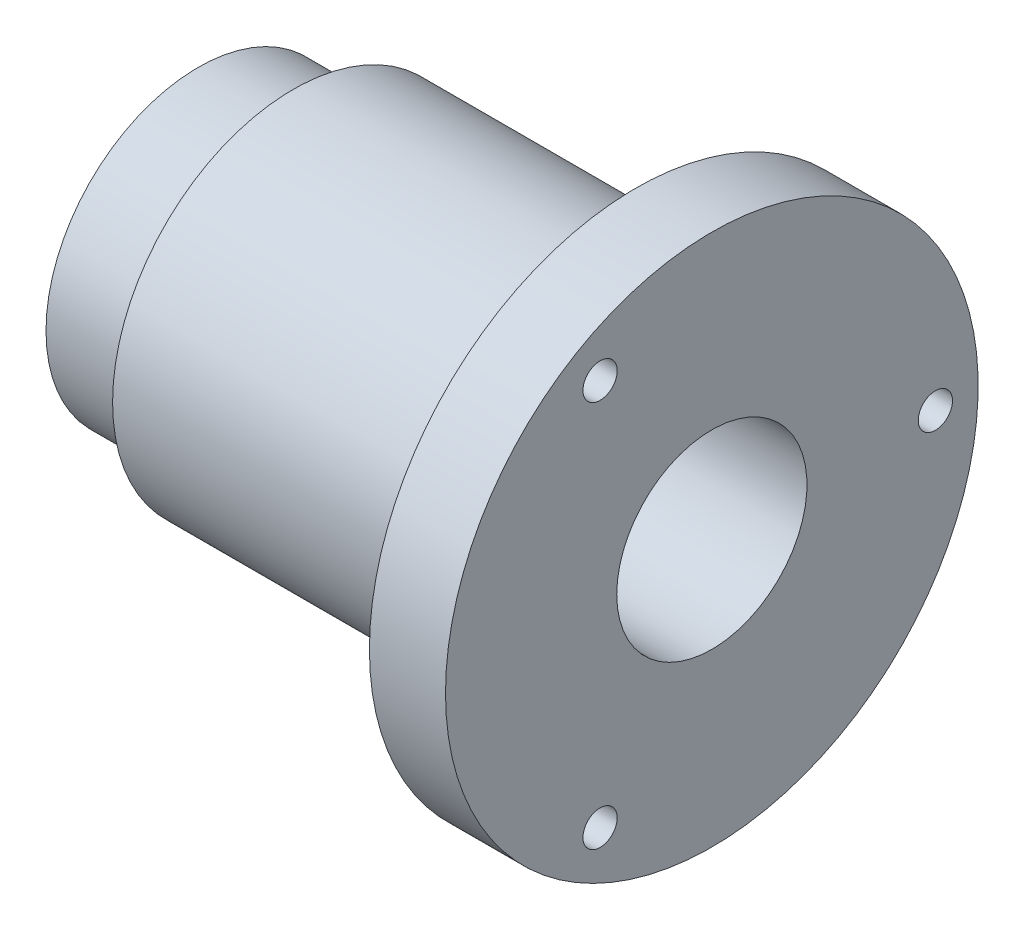
ISO-10303-21;
HEADER;
FILE_DESCRIPTION(('STEP AP214'),'2;1');
FILE_NAME('part.step','',(''),(''),'','','');
FILE_SCHEMA(('AUTOMOTIVE_DESIGN { 1 0 10303 214 1 1 1 1 }'));
ENDSEC;
DATA;
#1=APPLICATION_CONTEXT('core data for automotive mechanical design processes');
#2=APPLICATION_PROTOCOL_DEFINITION('international standard','automotive_design',2000,#1);
#3=PRODUCT_CONTEXT('',#1,'mechanical');
#4=PRODUCT('Part','Part','',(#3));
#5=PRODUCT_RELATED_PRODUCT_CATEGORY('part','',(#4));
#6=PRODUCT_DEFINITION_FORMATION('','',#4);
#7=PRODUCT_DEFINITION_CONTEXT('part definition',#1,'design');
#8=PRODUCT_DEFINITION('design','',#6,#7);
#9=PRODUCT_DEFINITION_SHAPE('','',#8);
#10=(LENGTH_UNIT() NAMED_UNIT(*) SI_UNIT(.MILLI.,.METRE.));
#11=(NAMED_UNIT(*) PLANE_ANGLE_UNIT() SI_UNIT($,.RADIAN.));
#12=(NAMED_UNIT(*) SI_UNIT($,.STERADIAN.) SOLID_ANGLE_UNIT());
#13=UNCERTAINTY_MEASURE_WITH_UNIT(LENGTH_MEASURE(1.E-05),#10,'distance_accuracy_value','');
#14=(GEOMETRIC_REPRESENTATION_CONTEXT(3) GLOBAL_UNCERTAINTY_ASSIGNED_CONTEXT((#13)) GLOBAL_UNIT_ASSIGNED_CONTEXT((#10,
#11,#12)) REPRESENTATION_CONTEXT('',''));
#15=CARTESIAN_POINT('',(0.,0.,0.));
#16=DIRECTION('',(0.,0.,1.));
#17=DIRECTION('',(1.,0.,0.));
#18=AXIS2_PLACEMENT_3D('',#15,#16,#17);
#19=CARTESIAN_POINT('',(0.,0.,-5.));
#20=DIRECTION('',(1.,0.,0.));
#21=DIRECTION('',(0.,0.,-1.));
#22=AXIS2_PLACEMENT_3D('',#19,#20,#21);
#23=PLANE('',#22);
#24=CARTESIAN_POINT('',(0.,0.,0.));
#25=DIRECTION('',(-1.,0.,0.));
#26=DIRECTION('',(0.,0.,1.));
#27=AXIS2_PLACEMENT_3D('',#24,#25,#26);
#28=CIRCLE('',#27,5.);
#29=CARTESIAN_POINT('',(0.,0.,5.));
#30=VERTEX_POINT('',#29);
#31=EDGE_CURVE('E61',#30,#30,#28,.T.);
#32=ORIENTED_EDGE('',*,*,#31,.F.);
#33=EDGE_LOOP('',(#32));
#34=FACE_BOUND('',#33,.T.);
#35=CARTESIAN_POINT('',(0.,0.,0.));
#36=DIRECTION('',(-1.,0.,0.));
#37=DIRECTION('',(0.,0.,1.));
#38=AXIS2_PLACEMENT_3D('',#35,#36,#37);
#39=CIRCLE('',#38,8.);
#40=CARTESIAN_POINT('',(0.,0.,8.));
#41=VERTEX_POINT('',#40);
#42=EDGE_CURVE('E10',#41,#41,#39,.T.);
#43=ORIENTED_EDGE('',*,*,#42,.T.);
#44=EDGE_LOOP('',(#43));
#45=FACE_BOUND('',#44,.T.);
#46=ADVANCED_FACE('F33',(#34,#45),#23,.F.);
#47=CARTESIAN_POINT('',(0.,0.,0.));
#48=DIRECTION('',(-1.,0.,0.));
#49=DIRECTION('',(0.,0.,1.));
#50=AXIS2_PLACEMENT_3D('',#47,#48,#49);
#51=CYLINDRICAL_SURFACE('',#50,8.);
#52=ORIENTED_EDGE('',*,*,#42,.F.);
#53=EDGE_LOOP('',(#52));
#54=FACE_BOUND('',#53,.T.);
#55=CARTESIAN_POINT('',(5.,0.,0.));
#56=DIRECTION('',(-1.,0.,0.));
#57=DIRECTION('',(0.,0.,1.));
#58=AXIS2_PLACEMENT_3D('',#55,#56,#57);
#59=CIRCLE('',#58,8.);
#60=CARTESIAN_POINT('',(5.,0.,8.));
#61=VERTEX_POINT('',#60);
#62=EDGE_CURVE('E39',#61,#61,#59,.T.);
#63=ORIENTED_EDGE('',*,*,#62,.T.);
#64=EDGE_LOOP('',(#63));
#65=FACE_BOUND('',#64,.T.);
#66=ADVANCED_FACE('F125',(#54,#65),#51,.T.);
#67=CARTESIAN_POINT('',(5.,0.,-8.));
#68=DIRECTION('',(1.,0.,0.));
#69=DIRECTION('',(0.,0.,-1.));
#70=AXIS2_PLACEMENT_3D('',#67,#68,#69);
#71=PLANE('',#70);
#72=ORIENTED_EDGE('',*,*,#62,.F.);
#73=EDGE_LOOP('',(#72));
#74=FACE_BOUND('',#73,.T.);
#75=CARTESIAN_POINT('',(5.,0.,0.));
#76=DIRECTION('',(-1.,0.,0.));
#77=DIRECTION('',(0.,0.,1.));
#78=AXIS2_PLACEMENT_3D('',#75,#76,#77);
#79=CIRCLE('',#78,9.5);
#80=CARTESIAN_POINT('',(5.,0.,9.5));
#81=VERTEX_POINT('',#80);
#82=EDGE_CURVE('E43',#81,#81,#79,.T.);
#83=ORIENTED_EDGE('',*,*,#82,.T.);
#84=EDGE_LOOP('',(#83));
#85=FACE_BOUND('',#84,.T.);
#86=ADVANCED_FACE('F129',(#74,#85),#71,.F.);
#87=CARTESIAN_POINT('',(0.,0.,0.));
#88=DIRECTION('',(-1.,0.,0.));
#89=DIRECTION('',(0.,0.,1.));
#90=AXIS2_PLACEMENT_3D('',#87,#88,#89);
#91=CYLINDRICAL_SURFACE('',#90,9.5);
#92=ORIENTED_EDGE('',*,*,#82,.F.);
#93=EDGE_LOOP('',(#92));
#94=FACE_BOUND('',#93,.T.);
#95=CARTESIAN_POINT('',(23.,0.,0.));
#96=DIRECTION('',(-1.,0.,0.));
#97=DIRECTION('',(0.,0.,1.));
#98=AXIS2_PLACEMENT_3D('',#95,#96,#97);
#99=CIRCLE('',#98,9.5);
#100=CARTESIAN_POINT('',(23.,0.,9.5));
#101=VERTEX_POINT('',#100);
#102=EDGE_CURVE('E47',#101,#101,#99,.T.);
#103=ORIENTED_EDGE('',*,*,#102,.T.);
#104=EDGE_LOOP('',(#103));
#105=FACE_BOUND('',#104,.T.);
#106=ADVANCED_FACE('F97',(#94,#105),#91,.T.);
#107=CARTESIAN_POINT('',(23.,0.,-9.5));
#108=DIRECTION('',(1.,0.,0.));
#109=DIRECTION('',(0.,0.,-1.));
#110=AXIS2_PLACEMENT_3D('',#107,#108,#109);
#111=PLANE('',#110);
#112=CARTESIAN_POINT('',(23.,-10.1757984944671,5.87500000000005));
#113=DIRECTION('',(-1.,0.,0.));
#114=DIRECTION('',(0.,0.866025403784436,-0.500000000000004));
#115=AXIS2_PLACEMENT_3D('',#112,#113,#114);
#116=CIRCLE('',#115,0.9);
#117=CARTESIAN_POINT('',(23.,-9.39637563106114,5.42500000000004));
#118=VERTEX_POINT('',#117);
#119=EDGE_CURVE('E68',#118,#118,#116,.T.);
#120=ORIENTED_EDGE('',*,*,#119,.F.);
#121=EDGE_LOOP('',(#120));
#122=FACE_BOUND('',#121,.T.);
#123=CARTESIAN_POINT('',(23.,10.1757984944672,5.87499999999991));
#124=DIRECTION('',(-1.,0.,0.));
#125=DIRECTION('',(0.,-0.866025403784443,-0.499999999999992));
#126=AXIS2_PLACEMENT_3D('',#123,#124,#125);
#127=CIRCLE('',#126,0.9);
#128=CARTESIAN_POINT('',(23.,9.39637563106121,5.42499999999991));
#129=VERTEX_POINT('',#128);
#130=EDGE_CURVE('E71',#129,#129,#127,.T.);
#131=ORIENTED_EDGE('',*,*,#130,.F.);
#132=EDGE_LOOP('',(#131));
#133=FACE_BOUND('',#132,.T.);
#134=CARTESIAN_POINT('',(23.,0.,-11.75));
#135=DIRECTION('',(-1.,0.,0.));
#136=DIRECTION('',(0.,0.,1.));
#137=AXIS2_PLACEMENT_3D('',#134,#135,#136);
#138=CIRCLE('',#137,0.9);
#139=CARTESIAN_POINT('',(23.,0.,-10.85));
#140=VERTEX_POINT('',#139);
#141=EDGE_CURVE('E65',#140,#140,#138,.T.);
#142=ORIENTED_EDGE('',*,*,#141,.F.);
#143=EDGE_LOOP('',(#142));
#144=FACE_BOUND('',#143,.T.);
#145=ORIENTED_EDGE('',*,*,#102,.F.);
#146=EDGE_LOOP('',(#145));
#147=FACE_BOUND('',#146,.T.);
#148=CARTESIAN_POINT('',(23.,0.,0.));
#149=DIRECTION('',(-1.,0.,0.));
#150=DIRECTION('',(0.,0.,1.));
#151=AXIS2_PLACEMENT_3D('',#148,#149,#150);
#152=CIRCLE('',#151,14.);
#153=CARTESIAN_POINT('',(23.,0.,14.));
#154=VERTEX_POINT('',#153);
#155=EDGE_CURVE('E52',#154,#154,#152,.T.);
#156=ORIENTED_EDGE('',*,*,#155,.T.);
#157=EDGE_LOOP('',(#156));
#158=FACE_BOUND('',#157,.T.);
#159=ADVANCED_FACE('F93',(#122,#133,#144,#147,#158),#111,.F.);
#160=CARTESIAN_POINT('',(0.,0.,0.));
#161=DIRECTION('',(-1.,0.,0.));
#162=DIRECTION('',(0.,0.,1.));
#163=AXIS2_PLACEMENT_3D('',#160,#161,#162);
#164=CYLINDRICAL_SURFACE('',#163,14.);
#165=ORIENTED_EDGE('',*,*,#155,.F.);
#166=EDGE_LOOP('',(#165));
#167=FACE_BOUND('',#166,.T.);
#168=CARTESIAN_POINT('',(27.,0.,0.));
#169=DIRECTION('',(-1.,0.,0.));
#170=DIRECTION('',(0.,0.,1.));
#171=AXIS2_PLACEMENT_3D('',#168,#169,#170);
#172=CIRCLE('',#171,14.);
#173=CARTESIAN_POINT('',(27.,0.,14.));
#174=VERTEX_POINT('',#173);
#175=EDGE_CURVE('E55',#174,#174,#172,.T.);
#176=ORIENTED_EDGE('',*,*,#175,.T.);
#177=EDGE_LOOP('',(#176));
#178=FACE_BOUND('',#177,.T.);
#179=ADVANCED_FACE('F96',(#167,#178),#164,.T.);
#180=CARTESIAN_POINT('',(27.,0.,-14.));
#181=DIRECTION('',(-1.,0.,0.));
#182=DIRECTION('',(0.,0.,1.));
#183=AXIS2_PLACEMENT_3D('',#180,#181,#182);
#184=PLANE('',#183);
#185=CARTESIAN_POINT('',(27.,-10.1757984944671,5.87500000000005));
#186=DIRECTION('',(-1.,0.,0.));
#187=DIRECTION('',(0.,0.866025403784436,-0.500000000000004));
#188=AXIS2_PLACEMENT_3D('',#185,#186,#187);
#189=CIRCLE('',#188,0.9);
#190=CARTESIAN_POINT('',(27.,-9.39637563106114,5.42500000000004));
#191=VERTEX_POINT('',#190);
#192=EDGE_CURVE('E74',#191,#191,#189,.T.);
#193=ORIENTED_EDGE('',*,*,#192,.T.);
#194=EDGE_LOOP('',(#193));
#195=FACE_BOUND('',#194,.T.);
#196=CARTESIAN_POINT('',(27.,10.1757984944672,5.87499999999991));
#197=DIRECTION('',(-1.,0.,0.));
#198=DIRECTION('',(0.,-0.866025403784443,-0.499999999999992));
#199=AXIS2_PLACEMENT_3D('',#196,#197,#198);
#200=CIRCLE('',#199,0.9);
#201=CARTESIAN_POINT('',(27.,9.39637563106121,5.42499999999991));
#202=VERTEX_POINT('',#201);
#203=EDGE_CURVE('E75',#202,#202,#200,.T.);
#204=ORIENTED_EDGE('',*,*,#203,.T.);
#205=EDGE_LOOP('',(#204));
#206=FACE_BOUND('',#205,.T.);
#207=CARTESIAN_POINT('',(27.,0.,-11.75));
#208=DIRECTION('',(-1.,0.,0.));
#209=DIRECTION('',(0.,0.,1.));
#210=AXIS2_PLACEMENT_3D('',#207,#208,#209);
#211=CIRCLE('',#210,0.9);
#212=CARTESIAN_POINT('',(27.,0.,-10.85));
#213=VERTEX_POINT('',#212);
#214=EDGE_CURVE('E64',#213,#213,#211,.T.);
#215=ORIENTED_EDGE('',*,*,#214,.T.);
#216=EDGE_LOOP('',(#215));
#217=FACE_BOUND('',#216,.T.);
#218=ORIENTED_EDGE('',*,*,#175,.F.);
#219=EDGE_LOOP('',(#218));
#220=FACE_BOUND('',#219,.T.);
#221=CARTESIAN_POINT('',(27.,0.,0.));
#222=DIRECTION('',(-1.,0.,0.));
#223=DIRECTION('',(0.,0.,1.));
#224=AXIS2_PLACEMENT_3D('',#221,#222,#223);
#225=CIRCLE('',#224,5.);
#226=CARTESIAN_POINT('',(27.,0.,5.));
#227=VERTEX_POINT('',#226);
#228=EDGE_CURVE('E58',#227,#227,#225,.T.);
#229=ORIENTED_EDGE('',*,*,#228,.T.);
#230=EDGE_LOOP('',(#229));
#231=FACE_BOUND('',#230,.T.);
#232=ADVANCED_FACE('F83',(#195,#206,#217,#220,#231),#184,.F.);
#233=CARTESIAN_POINT('',(0.,0.,0.));
#234=DIRECTION('',(-1.,0.,0.));
#235=DIRECTION('',(0.,0.,1.));
#236=AXIS2_PLACEMENT_3D('',#233,#234,#235);
#237=CYLINDRICAL_SURFACE('',#236,5.);
#238=ORIENTED_EDGE('',*,*,#228,.F.);
#239=EDGE_LOOP('',(#238));
#240=FACE_BOUND('',#239,.T.);
#241=ORIENTED_EDGE('',*,*,#31,.T.);
#242=EDGE_LOOP('',(#241));
#243=FACE_BOUND('',#242,.T.);
#244=ADVANCED_FACE('F114',(#240,#243),#237,.F.);
#245=CARTESIAN_POINT('',(27.,0.,-11.75));
#246=DIRECTION('',(-1.,0.,0.));
#247=DIRECTION('',(0.,0.,1.));
#248=AXIS2_PLACEMENT_3D('',#245,#246,#247);
#249=CYLINDRICAL_SURFACE('',#248,0.9);
#250=ORIENTED_EDGE('',*,*,#214,.F.);
#251=EDGE_LOOP('',(#250));
#252=FACE_BOUND('',#251,.T.);
#253=ORIENTED_EDGE('',*,*,#141,.T.);
#254=EDGE_LOOP('',(#253));
#255=FACE_BOUND('',#254,.T.);
#256=ADVANCED_FACE('F120',(#252,#255),#249,.F.);
#257=CARTESIAN_POINT('',(27.,10.1757984944672,5.87499999999991));
#258=DIRECTION('',(-1.,0.,0.));
#259=DIRECTION('',(0.,-0.866025403784443,-0.499999999999992));
#260=AXIS2_PLACEMENT_3D('',#257,#258,#259);
#261=CYLINDRICAL_SURFACE('',#260,0.9);
#262=ORIENTED_EDGE('',*,*,#203,.F.);
#263=EDGE_LOOP('',(#262));
#264=FACE_BOUND('',#263,.T.);
#265=ORIENTED_EDGE('',*,*,#130,.T.);
#266=EDGE_LOOP('',(#265));
#267=FACE_BOUND('',#266,.T.);
#268=ADVANCED_FACE('F89',(#264,#267),#261,.F.);
#269=CARTESIAN_POINT('',(27.,-10.1757984944671,5.87500000000005));
#270=DIRECTION('',(-1.,0.,0.));
#271=DIRECTION('',(0.,0.866025403784436,-0.500000000000004));
#272=AXIS2_PLACEMENT_3D('',#269,#270,#271);
#273=CYLINDRICAL_SURFACE('',#272,0.9);
#274=ORIENTED_EDGE('',*,*,#192,.F.);
#275=EDGE_LOOP('',(#274));
#276=FACE_BOUND('',#275,.T.);
#277=ORIENTED_EDGE('',*,*,#119,.T.);
#278=EDGE_LOOP('',(#277));
#279=FACE_BOUND('',#278,.T.);
#280=ADVANCED_FACE('F86',(#276,#279),#273,.F.);
#281=CLOSED_SHELL('',(#46,#66,#86,#106,#159,#179,#232,#244,#256,#268,#280));
#282=MANIFOLD_SOLID_BREP('B2',#281);
#283=ADVANCED_BREP_SHAPE_REPRESENTATION('',(#18,#282),#14);
#284=SHAPE_DEFINITION_REPRESENTATION(#9,#283);
ENDSEC;
END-ISO-10303-21;
